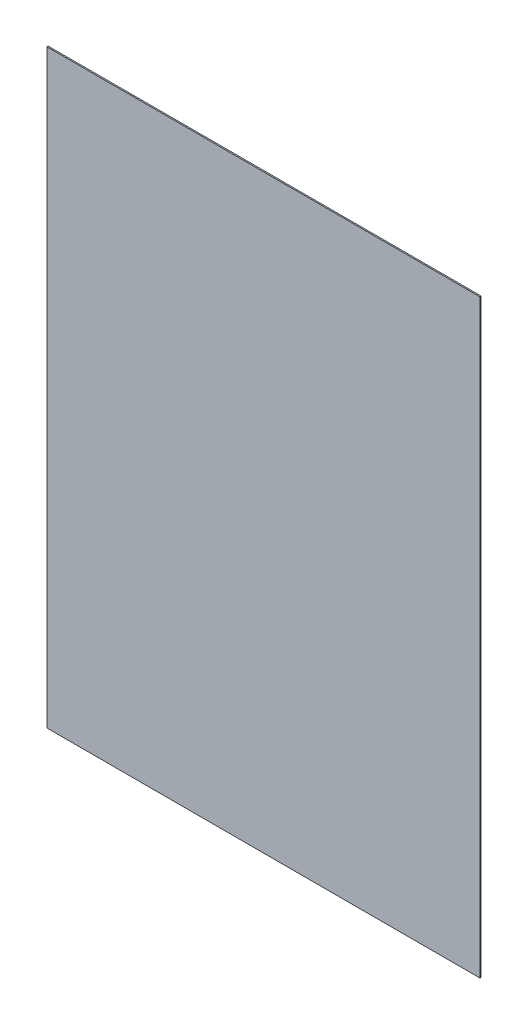
ISO-10303-21;
HEADER;
FILE_DESCRIPTION(('STEP AP214'),'2;1');
FILE_NAME('part.step','',(''),(''),'','','');
FILE_SCHEMA(('AUTOMOTIVE_DESIGN { 1 0 10303 214 1 1 1 1 }'));
ENDSEC;
DATA;
#1=APPLICATION_CONTEXT('core data for automotive mechanical design processes');
#2=APPLICATION_PROTOCOL_DEFINITION('international standard','automotive_design',2000,#1);
#3=PRODUCT_CONTEXT('',#1,'mechanical');
#4=PRODUCT('Part','Part','',(#3));
#5=PRODUCT_RELATED_PRODUCT_CATEGORY('part','',(#4));
#6=PRODUCT_DEFINITION_FORMATION('','',#4);
#7=PRODUCT_DEFINITION_CONTEXT('part definition',#1,'design');
#8=PRODUCT_DEFINITION('design','',#6,#7);
#9=PRODUCT_DEFINITION_SHAPE('','',#8);
#10=(LENGTH_UNIT() NAMED_UNIT(*) SI_UNIT(.MILLI.,.METRE.));
#11=(NAMED_UNIT(*) PLANE_ANGLE_UNIT() SI_UNIT($,.RADIAN.));
#12=(NAMED_UNIT(*) SI_UNIT($,.STERADIAN.) SOLID_ANGLE_UNIT());
#13=UNCERTAINTY_MEASURE_WITH_UNIT(LENGTH_MEASURE(1.E-05),#10,'distance_accuracy_value','');
#14=(GEOMETRIC_REPRESENTATION_CONTEXT(3) GLOBAL_UNCERTAINTY_ASSIGNED_CONTEXT((#13)) GLOBAL_UNIT_ASSIGNED_CONTEXT((#10,
#11,#12)) REPRESENTATION_CONTEXT('',''));
#15=CARTESIAN_POINT('',(0.,0.,0.));
#16=DIRECTION('',(0.,0.,1.));
#17=DIRECTION('',(1.,0.,0.));
#18=AXIS2_PLACEMENT_3D('',#15,#16,#17);
#19=CARTESIAN_POINT('',(0.,0.,-4.));
#20=DIRECTION('',(-1.,0.,0.));
#21=DIRECTION('',(0.,0.,1.));
#22=AXIS2_PLACEMENT_3D('',#19,#20,#21);
#23=PLANE('',#22);
#24=DIRECTION('',(0.,-1.,0.));
#25=VECTOR('',#24,1.);
#26=CARTESIAN_POINT('',(0.,0.,0.));
#27=LINE('',#26,#25);
#28=CARTESIAN_POINT('',(0.,1880.,0.));
#29=VERTEX_POINT('',#28);
#30=CARTESIAN_POINT('',(0.,0.,0.));
#31=VERTEX_POINT('',#30);
#32=EDGE_CURVE('E101',#29,#31,#27,.T.);
#33=ORIENTED_EDGE('',*,*,#32,.F.);
#34=DIRECTION('',(0.,0.,1.));
#35=VECTOR('',#34,1.);
#36=CARTESIAN_POINT('',(0.,1880.,-4.));
#37=LINE('',#36,#35);
#38=CARTESIAN_POINT('',(0.,1880.,-4.));
#39=VERTEX_POINT('',#38);
#40=EDGE_CURVE('E11',#39,#29,#37,.T.);
#41=ORIENTED_EDGE('',*,*,#40,.F.);
#42=DIRECTION('',(0.,-1.,0.));
#43=VECTOR('',#42,1.);
#44=CARTESIAN_POINT('',(0.,0.,-4.));
#45=LINE('',#44,#43);
#46=CARTESIAN_POINT('',(0.,0.,-4.));
#47=VERTEX_POINT('',#46);
#48=EDGE_CURVE('E95',#39,#47,#45,.T.);
#49=ORIENTED_EDGE('',*,*,#48,.T.);
#50=DIRECTION('',(0.,0.,1.));
#51=VECTOR('',#50,1.);
#52=CARTESIAN_POINT('',(0.,0.,-4.));
#53=LINE('',#52,#51);
#54=EDGE_CURVE('E40',#47,#31,#53,.T.);
#55=ORIENTED_EDGE('',*,*,#54,.T.);
#56=EDGE_LOOP('',(#33,#41,#49,#55));
#57=FACE_BOUND('',#56,.T.);
#58=ADVANCED_FACE('F37',(#57),#23,.T.);
#59=CARTESIAN_POINT('',(0.,1880.,-4.));
#60=DIRECTION('',(0.,1.,0.));
#61=DIRECTION('',(0.,0.,1.));
#62=AXIS2_PLACEMENT_3D('',#59,#60,#61);
#63=PLANE('',#62);
#64=DIRECTION('',(-1.,0.,0.));
#65=VECTOR('',#64,1.);
#66=CARTESIAN_POINT('',(0.,1880.,0.));
#67=LINE('',#66,#65);
#68=CARTESIAN_POINT('',(1380.,1880.,0.));
#69=VERTEX_POINT('',#68);
#70=EDGE_CURVE('E97',#69,#29,#67,.T.);
#71=ORIENTED_EDGE('',*,*,#70,.F.);
#72=DIRECTION('',(0.,0.,1.));
#73=VECTOR('',#72,1.);
#74=CARTESIAN_POINT('',(1380.,1880.,-4.));
#75=LINE('',#74,#73);
#76=CARTESIAN_POINT('',(1380.,1880.,-4.));
#77=VERTEX_POINT('',#76);
#78=EDGE_CURVE('E46',#77,#69,#75,.T.);
#79=ORIENTED_EDGE('',*,*,#78,.F.);
#80=DIRECTION('',(-1.,0.,0.));
#81=VECTOR('',#80,1.);
#82=CARTESIAN_POINT('',(0.,1880.,-4.));
#83=LINE('',#82,#81);
#84=EDGE_CURVE('E92',#77,#39,#83,.T.);
#85=ORIENTED_EDGE('',*,*,#84,.T.);
#86=ORIENTED_EDGE('',*,*,#40,.T.);
#87=EDGE_LOOP('',(#71,#79,#85,#86));
#88=FACE_BOUND('',#87,.T.);
#89=ADVANCED_FACE('F111',(#88),#63,.T.);
#90=CARTESIAN_POINT('',(1380.,0.,-4.));
#91=DIRECTION('',(1.,0.,0.));
#92=DIRECTION('',(0.,0.,-1.));
#93=AXIS2_PLACEMENT_3D('',#90,#91,#92);
#94=PLANE('',#93);
#95=DIRECTION('',(0.,1.,0.));
#96=VECTOR('',#95,1.);
#97=CARTESIAN_POINT('',(1380.,0.,0.));
#98=LINE('',#97,#96);
#99=CARTESIAN_POINT('',(1380.,0.,0.));
#100=VERTEX_POINT('',#99);
#101=EDGE_CURVE('E87',#100,#69,#98,.T.);
#102=ORIENTED_EDGE('',*,*,#101,.F.);
#103=DIRECTION('',(0.,0.,1.));
#104=VECTOR('',#103,1.);
#105=CARTESIAN_POINT('',(1380.,0.,-4.));
#106=LINE('',#105,#104);
#107=CARTESIAN_POINT('',(1380.,0.,-4.));
#108=VERTEX_POINT('',#107);
#109=EDGE_CURVE('E82',#108,#100,#106,.T.);
#110=ORIENTED_EDGE('',*,*,#109,.F.);
#111=DIRECTION('',(0.,1.,0.));
#112=VECTOR('',#111,1.);
#113=CARTESIAN_POINT('',(1380.,0.,-4.));
#114=LINE('',#113,#112);
#115=EDGE_CURVE('E85',#108,#77,#114,.T.);
#116=ORIENTED_EDGE('',*,*,#115,.T.);
#117=ORIENTED_EDGE('',*,*,#78,.T.);
#118=EDGE_LOOP('',(#102,#110,#116,#117));
#119=FACE_BOUND('',#118,.T.);
#120=ADVANCED_FACE('F84',(#119),#94,.T.);
#121=CARTESIAN_POINT('',(0.,0.,-4.));
#122=DIRECTION('',(0.,-1.,0.));
#123=DIRECTION('',(0.,0.,-1.));
#124=AXIS2_PLACEMENT_3D('',#121,#122,#123);
#125=PLANE('',#124);
#126=DIRECTION('',(1.,0.,0.));
#127=VECTOR('',#126,1.);
#128=CARTESIAN_POINT('',(0.,0.,0.));
#129=LINE('',#128,#127);
#130=EDGE_CURVE('E104',#31,#100,#129,.T.);
#131=ORIENTED_EDGE('',*,*,#130,.F.);
#132=ORIENTED_EDGE('',*,*,#54,.F.);
#133=DIRECTION('',(1.,0.,0.));
#134=VECTOR('',#133,1.);
#135=CARTESIAN_POINT('',(0.,0.,-4.));
#136=LINE('',#135,#134);
#137=EDGE_CURVE('E91',#47,#108,#136,.T.);
#138=ORIENTED_EDGE('',*,*,#137,.T.);
#139=ORIENTED_EDGE('',*,*,#109,.T.);
#140=EDGE_LOOP('',(#131,#132,#138,#139));
#141=FACE_BOUND('',#140,.T.);
#142=ADVANCED_FACE('F94',(#141),#125,.T.);
#143=CARTESIAN_POINT('',(0.,0.,-4.));
#144=DIRECTION('',(0.,0.,-1.));
#145=DIRECTION('',(-1.,0.,0.));
#146=AXIS2_PLACEMENT_3D('',#143,#144,#145);
#147=PLANE('',#146);
#148=ORIENTED_EDGE('',*,*,#48,.F.);
#149=ORIENTED_EDGE('',*,*,#84,.F.);
#150=ORIENTED_EDGE('',*,*,#115,.F.);
#151=ORIENTED_EDGE('',*,*,#137,.F.);
#152=EDGE_LOOP('',(#148,#149,#150,#151));
#153=FACE_BOUND('',#152,.T.);
#154=ADVANCED_FACE('F90',(#153),#147,.T.);
#155=CARTESIAN_POINT('',(0.,0.,0.));
#156=DIRECTION('',(0.,0.,-1.));
#157=DIRECTION('',(-1.,0.,0.));
#158=AXIS2_PLACEMENT_3D('',#155,#156,#157);
#159=PLANE('',#158);
#160=ORIENTED_EDGE('',*,*,#32,.T.);
#161=ORIENTED_EDGE('',*,*,#130,.T.);
#162=ORIENTED_EDGE('',*,*,#101,.T.);
#163=ORIENTED_EDGE('',*,*,#70,.T.);
#164=EDGE_LOOP('',(#160,#161,#162,#163));
#165=FACE_BOUND('',#164,.T.);
#166=ADVANCED_FACE('F110',(#165),#159,.F.);
#167=CLOSED_SHELL('',(#58,#89,#120,#142,#154,#166));
#168=MANIFOLD_SOLID_BREP('B2',#167);
#169=ADVANCED_BREP_SHAPE_REPRESENTATION('',(#18,#168),#14);
#170=SHAPE_DEFINITION_REPRESENTATION(#9,#169);
ENDSEC;
END-ISO-10303-21;
